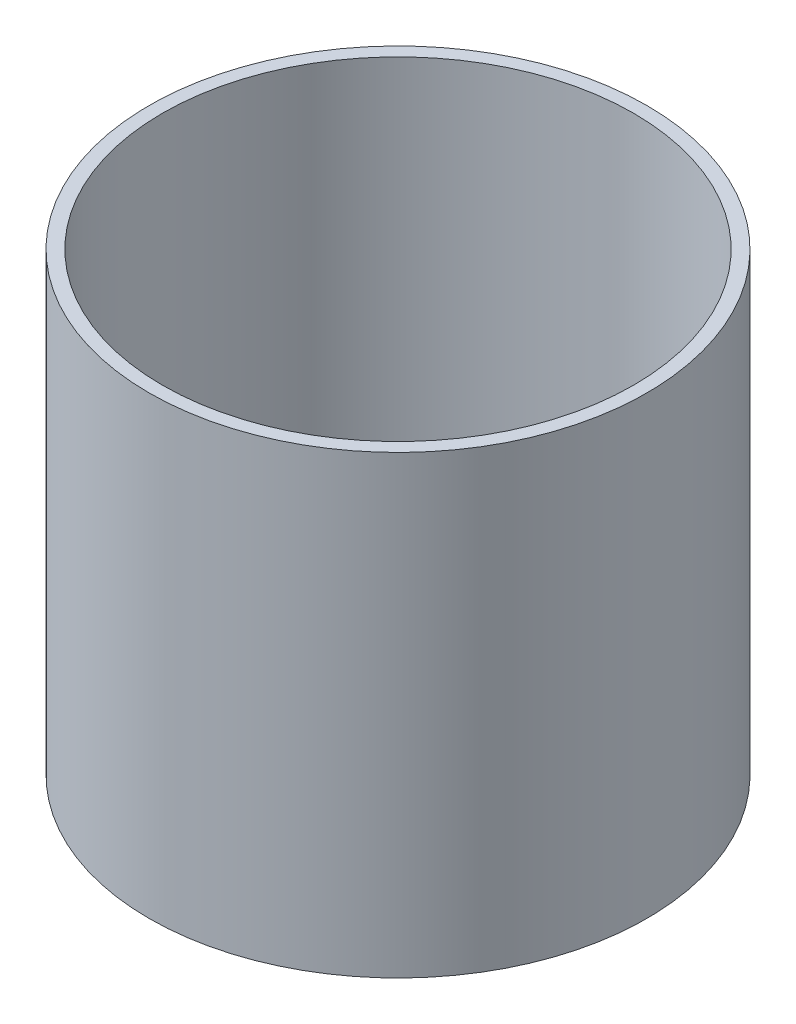
ISO-10303-21;
HEADER;
FILE_DESCRIPTION(('STEP AP214'),'2;1');
FILE_NAME('part.step','',(''),(''),'','','');
FILE_SCHEMA(('AUTOMOTIVE_DESIGN { 1 0 10303 214 1 1 1 1 }'));
ENDSEC;
DATA;
#1=APPLICATION_CONTEXT('core data for automotive mechanical design processes');
#2=APPLICATION_PROTOCOL_DEFINITION('international standard','automotive_design',2000,#1);
#3=PRODUCT_CONTEXT('',#1,'mechanical');
#4=PRODUCT('Part','Part','',(#3));
#5=PRODUCT_RELATED_PRODUCT_CATEGORY('part','',(#4));
#6=PRODUCT_DEFINITION_FORMATION('','',#4);
#7=PRODUCT_DEFINITION_CONTEXT('part definition',#1,'design');
#8=PRODUCT_DEFINITION('design','',#6,#7);
#9=PRODUCT_DEFINITION_SHAPE('','',#8);
#10=(LENGTH_UNIT() NAMED_UNIT(*) SI_UNIT(.MILLI.,.METRE.));
#11=(NAMED_UNIT(*) PLANE_ANGLE_UNIT() SI_UNIT($,.RADIAN.));
#12=(NAMED_UNIT(*) SI_UNIT($,.STERADIAN.) SOLID_ANGLE_UNIT());
#13=UNCERTAINTY_MEASURE_WITH_UNIT(LENGTH_MEASURE(1.E-05),#10,'distance_accuracy_value','');
#14=(GEOMETRIC_REPRESENTATION_CONTEXT(3) GLOBAL_UNCERTAINTY_ASSIGNED_CONTEXT((#13)) GLOBAL_UNIT_ASSIGNED_CONTEXT((#10,
#11,#12)) REPRESENTATION_CONTEXT('',''));
#15=CARTESIAN_POINT('',(0.,0.,0.));
#16=DIRECTION('',(0.,0.,1.));
#17=DIRECTION('',(1.,0.,0.));
#18=AXIS2_PLACEMENT_3D('',#15,#16,#17);
#19=CARTESIAN_POINT('',(0.,128.,0.));
#20=DIRECTION('',(0.,1.,0.));
#21=DIRECTION('',(0.,0.,1.));
#22=AXIS2_PLACEMENT_3D('',#19,#20,#21);
#23=PLANE('',#22);
#24=CARTESIAN_POINT('',(0.,128.,0.));
#25=DIRECTION('',(0.,1.,0.));
#26=DIRECTION('',(0.,0.,1.));
#27=AXIS2_PLACEMENT_3D('',#24,#25,#26);
#28=CIRCLE('',#27,70.);
#29=CARTESIAN_POINT('',(0.,128.,70.));
#30=VERTEX_POINT('',#29);
#31=EDGE_CURVE('E11',#30,#30,#28,.T.);
#32=ORIENTED_EDGE('',*,*,#31,.T.);
#33=EDGE_LOOP('',(#32));
#34=FACE_BOUND('',#33,.T.);
#35=CARTESIAN_POINT('',(0.,128.,0.));
#36=DIRECTION('',(0.,1.,0.));
#37=DIRECTION('',(1.,0.,0.));
#38=AXIS2_PLACEMENT_3D('',#35,#36,#37);
#39=CIRCLE('',#38,66.25);
#40=CARTESIAN_POINT('',(66.25,128.,0.));
#41=VERTEX_POINT('',#40);
#42=EDGE_CURVE('E54',#41,#41,#39,.T.);
#43=ORIENTED_EDGE('',*,*,#42,.F.);
#44=EDGE_LOOP('',(#43));
#45=FACE_BOUND('',#44,.T.);
#46=ADVANCED_FACE('F43',(#34,#45),#23,.T.);
#47=CARTESIAN_POINT('',(0.,0.,0.));
#48=DIRECTION('',(0.,1.,0.));
#49=DIRECTION('',(0.,0.,1.));
#50=AXIS2_PLACEMENT_3D('',#47,#48,#49);
#51=PLANE('',#50);
#52=CARTESIAN_POINT('',(0.,0.,0.));
#53=DIRECTION('',(0.,1.,0.));
#54=DIRECTION('',(0.,0.,1.));
#55=AXIS2_PLACEMENT_3D('',#52,#53,#54);
#56=CIRCLE('',#55,70.);
#57=CARTESIAN_POINT('',(0.,0.,70.));
#58=VERTEX_POINT('',#57);
#59=EDGE_CURVE('E47',#58,#58,#56,.T.);
#60=ORIENTED_EDGE('',*,*,#59,.F.);
#61=EDGE_LOOP('',(#60));
#62=FACE_BOUND('',#61,.T.);
#63=CARTESIAN_POINT('',(0.,0.,0.));
#64=DIRECTION('',(0.,1.,0.));
#65=DIRECTION('',(1.,0.,0.));
#66=AXIS2_PLACEMENT_3D('',#63,#64,#65);
#67=CIRCLE('',#66,66.25);
#68=CARTESIAN_POINT('',(66.25,0.,0.));
#69=VERTEX_POINT('',#68);
#70=EDGE_CURVE('E56',#69,#69,#67,.T.);
#71=ORIENTED_EDGE('',*,*,#70,.T.);
#72=EDGE_LOOP('',(#71));
#73=FACE_BOUND('',#72,.T.);
#74=ADVANCED_FACE('F66',(#62,#73),#51,.F.);
#75=CARTESIAN_POINT('',(0.,128.,0.));
#76=DIRECTION('',(0.,-1.,0.));
#77=DIRECTION('',(0.,0.,-1.));
#78=AXIS2_PLACEMENT_3D('',#75,#76,#77);
#79=CYLINDRICAL_SURFACE('',#78,70.);
#80=ORIENTED_EDGE('',*,*,#31,.F.);
#81=EDGE_LOOP('',(#80));
#82=FACE_BOUND('',#81,.T.);
#83=ORIENTED_EDGE('',*,*,#59,.T.);
#84=EDGE_LOOP('',(#83));
#85=FACE_BOUND('',#84,.T.);
#86=ADVANCED_FACE('F45',(#82,#85),#79,.T.);
#87=CARTESIAN_POINT('',(0.,128.,0.));
#88=DIRECTION('',(0.,-1.,0.));
#89=DIRECTION('',(0.,0.,-1.));
#90=AXIS2_PLACEMENT_3D('',#87,#88,#89);
#91=CYLINDRICAL_SURFACE('',#90,66.25);
#92=ORIENTED_EDGE('',*,*,#42,.T.);
#93=EDGE_LOOP('',(#92));
#94=FACE_BOUND('',#93,.T.);
#95=ORIENTED_EDGE('',*,*,#70,.F.);
#96=EDGE_LOOP('',(#95));
#97=FACE_BOUND('',#96,.T.);
#98=ADVANCED_FACE('F62',(#94,#97),#91,.F.);
#99=CLOSED_SHELL('',(#46,#74,#86,#98));
#100=MANIFOLD_SOLID_BREP('B2',#99);
#101=ADVANCED_BREP_SHAPE_REPRESENTATION('',(#18,#100),#14);
#102=SHAPE_DEFINITION_REPRESENTATION(#9,#101);
ENDSEC;
END-ISO-10303-21;
